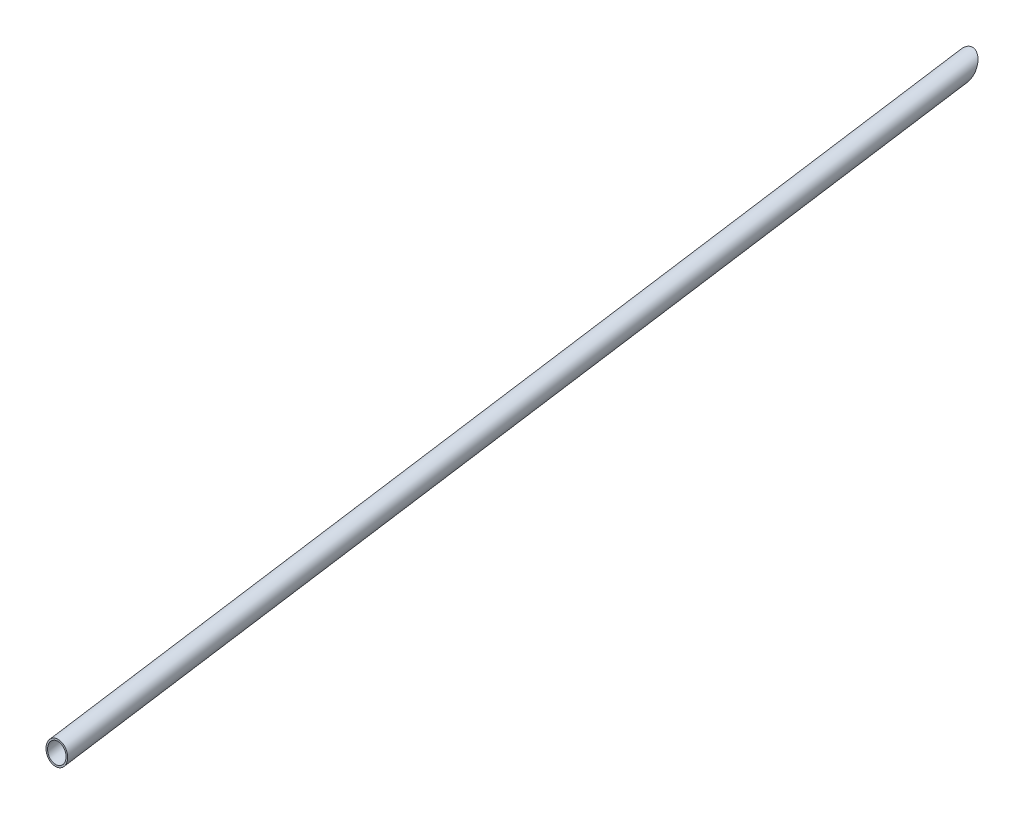
ISO-10303-21;
HEADER;
FILE_DESCRIPTION(('STEP AP214'),'2;1');
FILE_NAME('part.step','',(''),(''),'','','');
FILE_SCHEMA(('AUTOMOTIVE_DESIGN { 1 0 10303 214 1 1 1 1 }'));
ENDSEC;
DATA;
#1=APPLICATION_CONTEXT('core data for automotive mechanical design processes');
#2=APPLICATION_PROTOCOL_DEFINITION('international standard','automotive_design',2000,#1);
#3=PRODUCT_CONTEXT('',#1,'mechanical');
#4=PRODUCT('Part','Part','',(#3));
#5=PRODUCT_RELATED_PRODUCT_CATEGORY('part','',(#4));
#6=PRODUCT_DEFINITION_FORMATION('','',#4);
#7=PRODUCT_DEFINITION_CONTEXT('part definition',#1,'design');
#8=PRODUCT_DEFINITION('design','',#6,#7);
#9=PRODUCT_DEFINITION_SHAPE('','',#8);
#10=(LENGTH_UNIT() NAMED_UNIT(*) SI_UNIT(.MILLI.,.METRE.));
#11=(NAMED_UNIT(*) PLANE_ANGLE_UNIT() SI_UNIT($,.RADIAN.));
#12=(NAMED_UNIT(*) SI_UNIT($,.STERADIAN.) SOLID_ANGLE_UNIT());
#13=UNCERTAINTY_MEASURE_WITH_UNIT(LENGTH_MEASURE(1.E-05),#10,'distance_accuracy_value','');
#14=(GEOMETRIC_REPRESENTATION_CONTEXT(3) GLOBAL_UNCERTAINTY_ASSIGNED_CONTEXT((#13)) GLOBAL_UNIT_ASSIGNED_CONTEXT((#10,
#11,#12)) REPRESENTATION_CONTEXT('',''));
#15=CARTESIAN_POINT('',(0.,0.,0.));
#16=DIRECTION('',(0.,0.,1.));
#17=DIRECTION('',(1.,0.,0.));
#18=AXIS2_PLACEMENT_3D('',#15,#16,#17);
#19=CARTESIAN_POINT('',(150.,2.22044604925031E-13,-825.));
#20=DIRECTION('',(0.20871080944,0.381642622975999,-0.900438063583998));
#21=DIRECTION('',(0.,0.920714591276893,0.390236647958419));
#22=AXIS2_PLACEMENT_3D('',#19,#20,#21);
#23=CYLINDRICAL_SURFACE('',#22,9.39999999999998);
#24=CARTESIAN_POINT('',(150.,1.79159353021816E-13,-825.));
#25=DIRECTION('',(-0.0197141066523152,0.0461644942318043,0.998739302055958));
#26=DIRECTION('',(0.412111349099456,0.910500714966001,-0.033951200123519));
#27=AXIS2_PLACEMENT_3D('',#24,#25,#26);
#28=ELLIPSE('',#27,10.6118871519751,9.39999999999998);
#29=CARTESIAN_POINT('',(154.373279130691,9.66213083901202,-825.360286304385));
#30=VERTEX_POINT('',#29);
#31=EDGE_CURVE('E53',#30,#30,#28,.T.);
#32=ORIENTED_EDGE('',*,*,#31,.T.);
#33=EDGE_LOOP('',(#32));
#34=FACE_BOUND('',#33,.T.);
#35=CARTESIAN_POINT('',(325.,320.,-1580.));
#36=DIRECTION('',(-0.00416950723616232,-0.393939167319851,-0.919127057408686));
#37=DIRECTION('',(0.2871987901008,0.87994037819309,-0.37844654284329));
#38=AXIS2_PLACEMENT_3D('',#35,#36,#37);
#39=ELLIPSE('',#38,13.8970449959828,9.39999999999998);
#40=CARTESIAN_POINT('',(328.991214508823,332.228571029532,-1585.25928863447));
#41=VERTEX_POINT('',#40);
#42=EDGE_CURVE('E43',#41,#41,#39,.T.);
#43=ORIENTED_EDGE('',*,*,#42,.T.);
#44=EDGE_LOOP('',(#43));
#45=FACE_BOUND('',#44,.T.);
#46=ADVANCED_FACE('F39',(#34,#45),#23,.F.);
#47=CARTESIAN_POINT('',(150.,2.22044604925031E-13,-825.));
#48=DIRECTION('',(0.20871080944,0.381642622975999,-0.900438063583998));
#49=DIRECTION('',(0.,0.920714591276893,0.390236647958419));
#50=AXIS2_PLACEMENT_3D('',#47,#48,#49);
#51=CYLINDRICAL_SURFACE('',#50,11.);
#52=CARTESIAN_POINT('',(150.,1.79159353021816E-13,-825.));
#53=DIRECTION('',(-0.0197141066523152,0.0461644942318043,0.998739302055958));
#54=DIRECTION('',(0.412111349099456,0.910500714966001,-0.033951200123519));
#55=AXIS2_PLACEMENT_3D('',#52,#53,#54);
#56=ELLIPSE('',#55,12.4181658161411,11.);
#57=CARTESIAN_POINT('',(155.11766706783,11.306748854163,-825.421611632791));
#58=VERTEX_POINT('',#57);
#59=EDGE_CURVE('E47',#58,#58,#56,.T.);
#60=ORIENTED_EDGE('',*,*,#59,.F.);
#61=EDGE_LOOP('',(#60));
#62=FACE_BOUND('',#61,.T.);
#63=CARTESIAN_POINT('',(325.,320.,-1580.));
#64=DIRECTION('',(-0.00416950723616232,-0.393939167319851,-0.919127057408686));
#65=DIRECTION('',(0.2871987901008,0.87994037819309,-0.37844654284329));
#66=AXIS2_PLACEMENT_3D('',#63,#64,#65);
#67=ELLIPSE('',#66,16.2624994633842,11.);
#68=CARTESIAN_POINT('',(329.670570169899,334.310029928175,-1586.15448669991));
#69=VERTEX_POINT('',#68);
#70=EDGE_CURVE('E10',#69,#69,#67,.T.);
#71=ORIENTED_EDGE('',*,*,#70,.F.);
#72=EDGE_LOOP('',(#71));
#73=FACE_BOUND('',#72,.T.);
#74=ADVANCED_FACE('F67',(#62,#73),#51,.T.);
#75=CARTESIAN_POINT('',(150.,0.,-825.));
#76=DIRECTION('',(-0.0197141066523152,0.0461644942318043,0.998739302055958));
#77=DIRECTION('',(0.,-0.998933436662963,0.0461734676705454));
#78=AXIS2_PLACEMENT_3D('',#75,#76,#77);
#79=PLANE('',#78);
#80=ORIENTED_EDGE('',*,*,#31,.F.);
#81=EDGE_LOOP('',(#80));
#82=FACE_BOUND('',#81,.T.);
#83=ORIENTED_EDGE('',*,*,#59,.T.);
#84=EDGE_LOOP('',(#83));
#85=FACE_BOUND('',#84,.T.);
#86=ADVANCED_FACE('F62',(#82,#85),#79,.T.);
#87=CARTESIAN_POINT('',(325.,320.,-1580.));
#88=DIRECTION('',(-0.00416950723616232,-0.393939167319851,-0.919127057408686));
#89=DIRECTION('',(0.,0.919135046928569,-0.393942591639465));
#90=AXIS2_PLACEMENT_3D('',#87,#88,#89);
#91=PLANE('',#90);
#92=ORIENTED_EDGE('',*,*,#42,.F.);
#93=EDGE_LOOP('',(#92));
#94=FACE_BOUND('',#93,.T.);
#95=ORIENTED_EDGE('',*,*,#70,.T.);
#96=EDGE_LOOP('',(#95));
#97=FACE_BOUND('',#96,.T.);
#98=ADVANCED_FACE('F41',(#94,#97),#91,.T.);
#99=CLOSED_SHELL('',(#46,#74,#86,#98));
#100=MANIFOLD_SOLID_BREP('B2',#99);
#101=ADVANCED_BREP_SHAPE_REPRESENTATION('',(#18,#100),#14);
#102=SHAPE_DEFINITION_REPRESENTATION(#9,#101);
ENDSEC;
END-ISO-10303-21;
